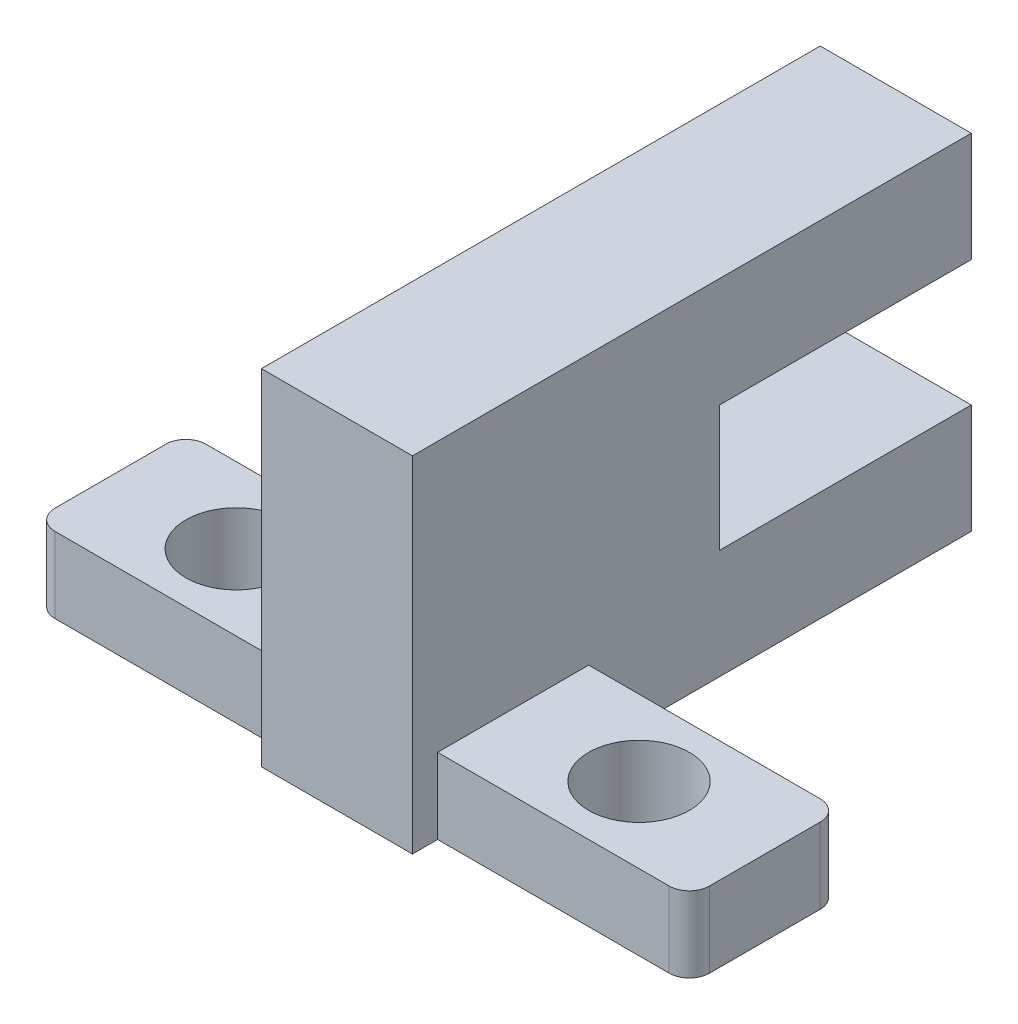
ISO-10303-21;
HEADER;
FILE_DESCRIPTION(('STEP AP214'),'2;1');
FILE_NAME('part.step','',(''),(''),'','','');
FILE_SCHEMA(('AUTOMOTIVE_DESIGN { 1 0 10303 214 1 1 1 1 }'));
ENDSEC;
DATA;
#1=APPLICATION_CONTEXT('core data for automotive mechanical design processes');
#2=APPLICATION_PROTOCOL_DEFINITION('international standard','automotive_design',2000,#1);
#3=PRODUCT_CONTEXT('',#1,'mechanical');
#4=PRODUCT('Part','Part','',(#3));
#5=PRODUCT_RELATED_PRODUCT_CATEGORY('part','',(#4));
#6=PRODUCT_DEFINITION_FORMATION('','',#4);
#7=PRODUCT_DEFINITION_CONTEXT('part definition',#1,'design');
#8=PRODUCT_DEFINITION('design','',#6,#7);
#9=PRODUCT_DEFINITION_SHAPE('','',#8);
#10=(LENGTH_UNIT() NAMED_UNIT(*) SI_UNIT(.MILLI.,.METRE.));
#11=(NAMED_UNIT(*) PLANE_ANGLE_UNIT() SI_UNIT($,.RADIAN.));
#12=(NAMED_UNIT(*) SI_UNIT($,.STERADIAN.) SOLID_ANGLE_UNIT());
#13=UNCERTAINTY_MEASURE_WITH_UNIT(LENGTH_MEASURE(1.E-05),#10,'distance_accuracy_value','');
#14=(GEOMETRIC_REPRESENTATION_CONTEXT(3) GLOBAL_UNCERTAINTY_ASSIGNED_CONTEXT((#13)) GLOBAL_UNIT_ASSIGNED_CONTEXT((#10,
#11,#12)) REPRESENTATION_CONTEXT('',''));
#15=CARTESIAN_POINT('',(0.,0.,0.));
#16=DIRECTION('',(0.,0.,1.));
#17=DIRECTION('',(1.,0.,0.));
#18=AXIS2_PLACEMENT_3D('',#15,#16,#17);
#19=CARTESIAN_POINT('',(6.,-2.5,0.));
#20=DIRECTION('',(0.,1.,0.));
#21=DIRECTION('',(0.,0.,1.));
#22=AXIS2_PLACEMENT_3D('',#19,#20,#21);
#23=PLANE('',#22);
#24=DIRECTION('',(0.,0.,-1.));
#25=VECTOR('',#24,1.);
#26=CARTESIAN_POINT('',(0.,-2.5,0.));
#27=LINE('',#26,#25);
#28=CARTESIAN_POINT('',(0.,-2.5,-1.1));
#29=VERTEX_POINT('',#28);
#30=CARTESIAN_POINT('',(0.,-2.5,-11.1));
#31=VERTEX_POINT('',#30);
#32=EDGE_CURVE('E211',#29,#31,#27,.T.);
#33=ORIENTED_EDGE('',*,*,#32,.F.);
#34=DIRECTION('',(-1.,0.,0.));
#35=VECTOR('',#34,1.);
#36=CARTESIAN_POINT('',(6.,-2.5,-1.1));
#37=LINE('',#36,#35);
#38=CARTESIAN_POINT('',(6.,-2.5,-1.1));
#39=VERTEX_POINT('',#38);
#40=EDGE_CURVE('E268',#39,#29,#37,.T.);
#41=ORIENTED_EDGE('',*,*,#40,.F.);
#42=DIRECTION('',(0.,0.,-1.));
#43=VECTOR('',#42,1.);
#44=CARTESIAN_POINT('',(6.,-2.5,0.));
#45=LINE('',#44,#43);
#46=CARTESIAN_POINT('',(6.,-2.5,-11.1));
#47=VERTEX_POINT('',#46);
#48=EDGE_CURVE('E212',#39,#47,#45,.T.);
#49=ORIENTED_EDGE('',*,*,#48,.T.);
#50=DIRECTION('',(-1.,0.,0.));
#51=VECTOR('',#50,1.);
#52=CARTESIAN_POINT('',(6.,-2.5,-11.1));
#53=LINE('',#52,#51);
#54=EDGE_CURVE('E252',#47,#31,#53,.T.);
#55=ORIENTED_EDGE('',*,*,#54,.T.);
#56=EDGE_LOOP('',(#33,#41,#49,#55));
#57=FACE_BOUND('',#56,.T.);
#58=ADVANCED_FACE('F37',(#57),#23,.T.);
#59=CARTESIAN_POINT('',(6.,0.,-1.1));
#60=DIRECTION('',(0.,0.,-1.));
#61=DIRECTION('',(0.,1.,0.));
#62=AXIS2_PLACEMENT_3D('',#59,#60,#61);
#63=PLANE('',#62);
#64=DIRECTION('',(0.,-1.,0.));
#65=VECTOR('',#64,1.);
#66=CARTESIAN_POINT('',(0.,0.,-1.1));
#67=LINE('',#66,#65);
#68=CARTESIAN_POINT('',(0.,2.5,-1.1));
#69=VERTEX_POINT('',#68);
#70=EDGE_CURVE('E234',#69,#29,#67,.T.);
#71=ORIENTED_EDGE('',*,*,#70,.F.);
#72=DIRECTION('',(-1.,0.,0.));
#73=VECTOR('',#72,1.);
#74=CARTESIAN_POINT('',(6.,2.5,-1.1));
#75=LINE('',#74,#73);
#76=CARTESIAN_POINT('',(6.,2.5,-1.1));
#77=VERTEX_POINT('',#76);
#78=EDGE_CURVE('E266',#77,#69,#75,.T.);
#79=ORIENTED_EDGE('',*,*,#78,.F.);
#80=DIRECTION('',(0.,-1.,0.));
#81=VECTOR('',#80,1.);
#82=CARTESIAN_POINT('',(6.,0.,-1.1));
#83=LINE('',#82,#81);
#84=EDGE_CURVE('E215',#77,#39,#83,.T.);
#85=ORIENTED_EDGE('',*,*,#84,.T.);
#86=ORIENTED_EDGE('',*,*,#40,.T.);
#87=EDGE_LOOP('',(#71,#79,#85,#86));
#88=FACE_BOUND('',#87,.T.);
#89=ADVANCED_FACE('F379',(#88),#63,.T.);
#90=CARTESIAN_POINT('',(6.,2.5,0.));
#91=DIRECTION('',(0.,1.,0.));
#92=DIRECTION('',(0.,0.,1.));
#93=AXIS2_PLACEMENT_3D('',#90,#91,#92);
#94=PLANE('',#93);
#95=DIRECTION('',(0.,0.,-1.));
#96=VECTOR('',#95,1.);
#97=CARTESIAN_POINT('',(0.,2.5,0.));
#98=LINE('',#97,#96);
#99=CARTESIAN_POINT('',(0.,2.5,-11.1));
#100=VERTEX_POINT('',#99);
#101=EDGE_CURVE('E237',#69,#100,#98,.T.);
#102=ORIENTED_EDGE('',*,*,#101,.T.);
#103=DIRECTION('',(-1.,0.,0.));
#104=VECTOR('',#103,1.);
#105=CARTESIAN_POINT('',(6.,2.5,-11.1));
#106=LINE('',#105,#104);
#107=CARTESIAN_POINT('',(6.,2.5,-11.1));
#108=VERTEX_POINT('',#107);
#109=EDGE_CURVE('E264',#108,#100,#106,.T.);
#110=ORIENTED_EDGE('',*,*,#109,.F.);
#111=DIRECTION('',(0.,0.,-1.));
#112=VECTOR('',#111,1.);
#113=CARTESIAN_POINT('',(6.,2.5,0.));
#114=LINE('',#113,#112);
#115=EDGE_CURVE('E219',#77,#108,#114,.T.);
#116=ORIENTED_EDGE('',*,*,#115,.F.);
#117=ORIENTED_EDGE('',*,*,#78,.T.);
#118=EDGE_LOOP('',(#102,#110,#116,#117));
#119=FACE_BOUND('',#118,.T.);
#120=ADVANCED_FACE('F385',(#119),#94,.F.);
#121=CARTESIAN_POINT('',(6.,0.,-11.1));
#122=DIRECTION('',(0.,0.,-1.));
#123=DIRECTION('',(0.,1.,0.));
#124=AXIS2_PLACEMENT_3D('',#121,#122,#123);
#125=PLANE('',#124);
#126=DIRECTION('',(0.,-1.,0.));
#127=VECTOR('',#126,1.);
#128=CARTESIAN_POINT('',(0.,0.,-11.1));
#129=LINE('',#128,#127);
#130=CARTESIAN_POINT('',(0.,6.85,-11.1));
#131=VERTEX_POINT('',#130);
#132=EDGE_CURVE('E240',#131,#100,#129,.T.);
#133=ORIENTED_EDGE('',*,*,#132,.F.);
#134=DIRECTION('',(-1.,0.,0.));
#135=VECTOR('',#134,1.);
#136=CARTESIAN_POINT('',(6.,6.85,-11.1));
#137=LINE('',#136,#135);
#138=CARTESIAN_POINT('',(6.,6.85,-11.1));
#139=VERTEX_POINT('',#138);
#140=EDGE_CURVE('E262',#139,#131,#137,.T.);
#141=ORIENTED_EDGE('',*,*,#140,.F.);
#142=DIRECTION('',(0.,-1.,0.));
#143=VECTOR('',#142,1.);
#144=CARTESIAN_POINT('',(6.,0.,-11.1));
#145=LINE('',#144,#143);
#146=EDGE_CURVE('E221',#139,#108,#145,.T.);
#147=ORIENTED_EDGE('',*,*,#146,.T.);
#148=ORIENTED_EDGE('',*,*,#109,.T.);
#149=EDGE_LOOP('',(#133,#141,#147,#148));
#150=FACE_BOUND('',#149,.T.);
#151=ADVANCED_FACE('F430',(#150),#125,.T.);
#152=CARTESIAN_POINT('',(6.,6.85,0.));
#153=DIRECTION('',(0.,1.,0.));
#154=DIRECTION('',(0.,0.,1.));
#155=AXIS2_PLACEMENT_3D('',#152,#153,#154);
#156=PLANE('',#155);
#157=DIRECTION('',(0.,0.,-1.));
#158=VECTOR('',#157,1.);
#159=CARTESIAN_POINT('',(0.,6.85,0.));
#160=LINE('',#159,#158);
#161=CARTESIAN_POINT('',(0.,6.85,11.1));
#162=VERTEX_POINT('',#161);
#163=EDGE_CURVE('E243',#162,#131,#160,.T.);
#164=ORIENTED_EDGE('',*,*,#163,.F.);
#165=DIRECTION('',(-1.,0.,0.));
#166=VECTOR('',#165,1.);
#167=CARTESIAN_POINT('',(6.,6.85,11.1));
#168=LINE('',#167,#166);
#169=CARTESIAN_POINT('',(6.,6.85,11.1));
#170=VERTEX_POINT('',#169);
#171=EDGE_CURVE('E260',#170,#162,#168,.T.);
#172=ORIENTED_EDGE('',*,*,#171,.F.);
#173=DIRECTION('',(0.,0.,-1.));
#174=VECTOR('',#173,1.);
#175=CARTESIAN_POINT('',(6.,6.85,0.));
#176=LINE('',#175,#174);
#177=EDGE_CURVE('E224',#170,#139,#176,.T.);
#178=ORIENTED_EDGE('',*,*,#177,.T.);
#179=ORIENTED_EDGE('',*,*,#140,.T.);
#180=EDGE_LOOP('',(#164,#172,#178,#179));
#181=FACE_BOUND('',#180,.T.);
#182=ADVANCED_FACE('F437',(#181),#156,.T.);
#183=CARTESIAN_POINT('',(6.,0.,11.1));
#184=DIRECTION('',(0.,0.,-1.));
#185=DIRECTION('',(0.,1.,0.));
#186=AXIS2_PLACEMENT_3D('',#183,#184,#185);
#187=PLANE('',#186);
#188=DIRECTION('',(0.,-1.,0.));
#189=VECTOR('',#188,1.);
#190=CARTESIAN_POINT('',(0.,0.,11.1));
#191=LINE('',#190,#189);
#192=CARTESIAN_POINT('',(0.,-6.85,11.1));
#193=VERTEX_POINT('',#192);
#194=EDGE_CURVE('E246',#162,#193,#191,.T.);
#195=ORIENTED_EDGE('',*,*,#194,.T.);
#196=DIRECTION('',(-1.,0.,0.));
#197=VECTOR('',#196,1.);
#198=CARTESIAN_POINT('',(6.,-6.85,11.1));
#199=LINE('',#198,#197);
#200=CARTESIAN_POINT('',(6.,-6.85,11.1));
#201=VERTEX_POINT('',#200);
#202=EDGE_CURVE('E257',#201,#193,#199,.T.);
#203=ORIENTED_EDGE('',*,*,#202,.F.);
#204=DIRECTION('',(0.,-1.,0.));
#205=VECTOR('',#204,1.);
#206=CARTESIAN_POINT('',(6.,0.,11.1));
#207=LINE('',#206,#205);
#208=EDGE_CURVE('E228',#170,#201,#207,.T.);
#209=ORIENTED_EDGE('',*,*,#208,.F.);
#210=ORIENTED_EDGE('',*,*,#171,.T.);
#211=EDGE_LOOP('',(#195,#203,#209,#210));
#212=FACE_BOUND('',#211,.T.);
#213=ADVANCED_FACE('F433',(#212),#187,.F.);
#214=CARTESIAN_POINT('',(6.,-6.85,0.));
#215=DIRECTION('',(0.,1.,0.));
#216=DIRECTION('',(0.,0.,1.));
#217=AXIS2_PLACEMENT_3D('',#214,#215,#216);
#218=PLANE('',#217);
#219=CARTESIAN_POINT('',(-5.,-6.85,7.1));
#220=DIRECTION('',(0.,1.,0.));
#221=DIRECTION('',(0.,0.,1.));
#222=AXIS2_PLACEMENT_3D('',#219,#220,#221);
#223=CIRCLE('',#222,2.);
#224=CARTESIAN_POINT('',(-5.,-6.85,9.1));
#225=VERTEX_POINT('',#224);
#226=EDGE_CURVE('E355',#225,#225,#223,.T.);
#227=ORIENTED_EDGE('',*,*,#226,.T.);
#228=EDGE_LOOP('',(#227));
#229=FACE_BOUND('',#228,.T.);
#230=CARTESIAN_POINT('',(11.,-6.85,7.1));
#231=DIRECTION('',(0.,1.,0.));
#232=DIRECTION('',(0.,0.,1.));
#233=AXIS2_PLACEMENT_3D('',#230,#231,#232);
#234=CIRCLE('',#233,2.);
#235=CARTESIAN_POINT('',(11.,-6.85,9.1));
#236=VERTEX_POINT('',#235);
#237=EDGE_CURVE('E347',#236,#236,#234,.T.);
#238=ORIENTED_EDGE('',*,*,#237,.T.);
#239=EDGE_LOOP('',(#238));
#240=FACE_BOUND('',#239,.T.);
#241=DIRECTION('',(0.,0.,-1.));
#242=VECTOR('',#241,1.);
#243=CARTESIAN_POINT('',(16.,-6.85,10.1));
#244=LINE('',#243,#242);
#245=CARTESIAN_POINT('',(16.,-6.85,9.3));
#246=VERTEX_POINT('',#245);
#247=CARTESIAN_POINT('',(16.,-6.85,4.9));
#248=VERTEX_POINT('',#247);
#249=EDGE_CURVE('E327',#246,#248,#244,.T.);
#250=ORIENTED_EDGE('',*,*,#249,.F.);
#251=CARTESIAN_POINT('',(15.2,-6.85,9.3));
#252=DIRECTION('',(0.,1.,0.));
#253=DIRECTION('',(0.,0.,1.));
#254=AXIS2_PLACEMENT_3D('',#251,#252,#253);
#255=CIRCLE('',#254,0.8);
#256=CARTESIAN_POINT('',(15.2,-6.85,10.1));
#257=VERTEX_POINT('',#256);
#258=EDGE_CURVE('E291',#246,#257,#255,.F.);
#259=ORIENTED_EDGE('',*,*,#258,.T.);
#260=DIRECTION('',(1.,0.,0.));
#261=VECTOR('',#260,1.);
#262=CARTESIAN_POINT('',(-10.,-6.85,10.1));
#263=LINE('',#262,#261);
#264=CARTESIAN_POINT('',(6.,-6.85,10.1));
#265=VERTEX_POINT('',#264);
#266=EDGE_CURVE('E204',#265,#257,#263,.T.);
#267=ORIENTED_EDGE('',*,*,#266,.F.);
#268=DIRECTION('',(0.,0.,-1.));
#269=VECTOR('',#268,1.);
#270=CARTESIAN_POINT('',(6.,-6.85,0.));
#271=LINE('',#270,#269);
#272=EDGE_CURVE('E181',#201,#265,#271,.T.);
#273=ORIENTED_EDGE('',*,*,#272,.F.);
#274=ORIENTED_EDGE('',*,*,#202,.T.);
#275=DIRECTION('',(0.,0.,-1.));
#276=VECTOR('',#275,1.);
#277=CARTESIAN_POINT('',(0.,-6.85,0.));
#278=LINE('',#277,#276);
#279=CARTESIAN_POINT('',(0.,-6.85,10.1));
#280=VERTEX_POINT('',#279);
#281=EDGE_CURVE('E249',#193,#280,#278,.T.);
#282=ORIENTED_EDGE('',*,*,#281,.T.);
#283=CARTESIAN_POINT('',(-9.2,-6.85,10.1));
#284=VERTEX_POINT('',#283);
#285=EDGE_CURVE('E207',#284,#280,#263,.T.);
#286=ORIENTED_EDGE('',*,*,#285,.F.);
#287=CARTESIAN_POINT('',(-9.2,-6.85,9.3));
#288=DIRECTION('',(0.,1.,0.));
#289=DIRECTION('',(0.,0.,1.));
#290=AXIS2_PLACEMENT_3D('',#287,#288,#289);
#291=CIRCLE('',#290,0.8);
#292=CARTESIAN_POINT('',(-10.,-6.85,9.3));
#293=VERTEX_POINT('',#292);
#294=EDGE_CURVE('E287',#284,#293,#291,.F.);
#295=ORIENTED_EDGE('',*,*,#294,.T.);
#296=DIRECTION('',(0.,0.,-1.));
#297=VECTOR('',#296,1.);
#298=CARTESIAN_POINT('',(-10.,-6.85,10.1));
#299=LINE('',#298,#297);
#300=CARTESIAN_POINT('',(-10.,-6.85,4.9));
#301=VERTEX_POINT('',#300);
#302=EDGE_CURVE('E323',#293,#301,#299,.T.);
#303=ORIENTED_EDGE('',*,*,#302,.T.);
#304=CARTESIAN_POINT('',(-9.2,-6.85,4.9));
#305=DIRECTION('',(0.,1.,0.));
#306=DIRECTION('',(0.,0.,1.));
#307=AXIS2_PLACEMENT_3D('',#304,#305,#306);
#308=CIRCLE('',#307,0.8);
#309=CARTESIAN_POINT('',(-9.2,-6.85,4.1));
#310=VERTEX_POINT('',#309);
#311=EDGE_CURVE('E285',#301,#310,#308,.F.);
#312=ORIENTED_EDGE('',*,*,#311,.T.);
#313=DIRECTION('',(1.,0.,0.));
#314=VECTOR('',#313,1.);
#315=CARTESIAN_POINT('',(-10.,-6.85,4.1));
#316=LINE('',#315,#314);
#317=CARTESIAN_POINT('',(0.,-6.85,4.1));
#318=VERTEX_POINT('',#317);
#319=EDGE_CURVE('E196',#310,#318,#316,.T.);
#320=ORIENTED_EDGE('',*,*,#319,.T.);
#321=CARTESIAN_POINT('',(0.,-6.85,-11.1));
#322=VERTEX_POINT('',#321);
#323=EDGE_CURVE('E248',#318,#322,#278,.T.);
#324=ORIENTED_EDGE('',*,*,#323,.T.);
#325=DIRECTION('',(-1.,0.,0.));
#326=VECTOR('',#325,1.);
#327=CARTESIAN_POINT('',(6.,-6.85,-11.1));
#328=LINE('',#327,#326);
#329=CARTESIAN_POINT('',(6.,-6.85,-11.1));
#330=VERTEX_POINT('',#329);
#331=EDGE_CURVE('E254',#330,#322,#328,.T.);
#332=ORIENTED_EDGE('',*,*,#331,.F.);
#333=CARTESIAN_POINT('',(6.,-6.85,4.1));
#334=VERTEX_POINT('',#333);
#335=EDGE_CURVE('E230',#334,#330,#271,.T.);
#336=ORIENTED_EDGE('',*,*,#335,.F.);
#337=CARTESIAN_POINT('',(15.2,-6.85,4.1));
#338=VERTEX_POINT('',#337);
#339=EDGE_CURVE('E330',#334,#338,#316,.T.);
#340=ORIENTED_EDGE('',*,*,#339,.T.);
#341=CARTESIAN_POINT('',(15.2,-6.85,4.9));
#342=DIRECTION('',(0.,1.,0.));
#343=DIRECTION('',(0.,0.,1.));
#344=AXIS2_PLACEMENT_3D('',#341,#342,#343);
#345=CIRCLE('',#344,0.8);
#346=EDGE_CURVE('E289',#338,#248,#345,.F.);
#347=ORIENTED_EDGE('',*,*,#346,.T.);
#348=EDGE_LOOP('',(#250,#259,#267,#273,#274,#282,#286,#295,#303,#312,#320,#324,#332,#336,#340,#347));
#349=FACE_BOUND('',#348,.T.);
#350=ADVANCED_FACE('F322',(#229,#240,#349),#218,.F.);
#351=EDGE_CURVE('E216',#31,#322,#129,.T.);
#352=ORIENTED_EDGE('',*,*,#351,.F.);
#353=ORIENTED_EDGE('',*,*,#54,.F.);
#354=EDGE_CURVE('E225',#47,#330,#145,.T.);
#355=ORIENTED_EDGE('',*,*,#354,.T.);
#356=ORIENTED_EDGE('',*,*,#331,.T.);
#357=EDGE_LOOP('',(#352,#353,#355,#356));
#358=FACE_BOUND('',#357,.T.);
#359=ADVANCED_FACE('F411',(#358),#125,.T.);
#360=CARTESIAN_POINT('',(6.,0.,0.));
#361=DIRECTION('',(1.,0.,0.));
#362=DIRECTION('',(0.,0.,-1.));
#363=AXIS2_PLACEMENT_3D('',#360,#361,#362);
#364=PLANE('',#363);
#365=DIRECTION('',(0.,1.,0.));
#366=VECTOR('',#365,1.);
#367=CARTESIAN_POINT('',(6.,0.,4.1));
#368=LINE('',#367,#366);
#369=CARTESIAN_POINT('',(6.,-3.85,4.1));
#370=VERTEX_POINT('',#369);
#371=EDGE_CURVE('E186',#334,#370,#368,.T.);
#372=ORIENTED_EDGE('',*,*,#371,.F.);
#373=ORIENTED_EDGE('',*,*,#335,.T.);
#374=ORIENTED_EDGE('',*,*,#354,.F.);
#375=ORIENTED_EDGE('',*,*,#48,.F.);
#376=ORIENTED_EDGE('',*,*,#84,.F.);
#377=ORIENTED_EDGE('',*,*,#115,.T.);
#378=ORIENTED_EDGE('',*,*,#146,.F.);
#379=ORIENTED_EDGE('',*,*,#177,.F.);
#380=ORIENTED_EDGE('',*,*,#208,.T.);
#381=ORIENTED_EDGE('',*,*,#272,.T.);
#382=DIRECTION('',(0.,-1.,0.));
#383=VECTOR('',#382,1.);
#384=CARTESIAN_POINT('',(6.,0.,10.1));
#385=LINE('',#384,#383);
#386=CARTESIAN_POINT('',(6.,-3.85,10.1));
#387=VERTEX_POINT('',#386);
#388=EDGE_CURVE('E175',#387,#265,#385,.T.);
#389=ORIENTED_EDGE('',*,*,#388,.F.);
#390=DIRECTION('',(0.,0.,1.));
#391=VECTOR('',#390,1.);
#392=CARTESIAN_POINT('',(6.,-3.85,0.));
#393=LINE('',#392,#391);
#394=EDGE_CURVE('E178',#370,#387,#393,.T.);
#395=ORIENTED_EDGE('',*,*,#394,.F.);
#396=EDGE_LOOP('',(#372,#373,#374,#375,#376,#377,#378,#379,#380,#381,#389,#395));
#397=FACE_BOUND('',#396,.T.);
#398=ADVANCED_FACE('F177',(#397),#364,.T.);
#399=CARTESIAN_POINT('',(0.,0.,0.));
#400=DIRECTION('',(1.,0.,0.));
#401=DIRECTION('',(0.,0.,-1.));
#402=AXIS2_PLACEMENT_3D('',#399,#400,#401);
#403=PLANE('',#402);
#404=ORIENTED_EDGE('',*,*,#323,.F.);
#405=DIRECTION('',(0.,1.,0.));
#406=VECTOR('',#405,1.);
#407=CARTESIAN_POINT('',(0.,0.,4.1));
#408=LINE('',#407,#406);
#409=CARTESIAN_POINT('',(0.,-3.85,4.1));
#410=VERTEX_POINT('',#409);
#411=EDGE_CURVE('E276',#318,#410,#408,.T.);
#412=ORIENTED_EDGE('',*,*,#411,.T.);
#413=DIRECTION('',(0.,0.,1.));
#414=VECTOR('',#413,1.);
#415=CARTESIAN_POINT('',(0.,-3.85,0.));
#416=LINE('',#415,#414);
#417=CARTESIAN_POINT('',(0.,-3.85,10.1));
#418=VERTEX_POINT('',#417);
#419=EDGE_CURVE('E270',#410,#418,#416,.T.);
#420=ORIENTED_EDGE('',*,*,#419,.T.);
#421=DIRECTION('',(0.,-1.,0.));
#422=VECTOR('',#421,1.);
#423=CARTESIAN_POINT('',(0.,0.,10.1));
#424=LINE('',#423,#422);
#425=EDGE_CURVE('E273',#418,#280,#424,.T.);
#426=ORIENTED_EDGE('',*,*,#425,.T.);
#427=ORIENTED_EDGE('',*,*,#281,.F.);
#428=ORIENTED_EDGE('',*,*,#194,.F.);
#429=ORIENTED_EDGE('',*,*,#163,.T.);
#430=ORIENTED_EDGE('',*,*,#132,.T.);
#431=ORIENTED_EDGE('',*,*,#101,.F.);
#432=ORIENTED_EDGE('',*,*,#70,.T.);
#433=ORIENTED_EDGE('',*,*,#32,.T.);
#434=ORIENTED_EDGE('',*,*,#351,.T.);
#435=EDGE_LOOP('',(#404,#412,#420,#426,#427,#428,#429,#430,#431,#432,#433,#434));
#436=FACE_BOUND('',#435,.T.);
#437=ADVANCED_FACE('F373',(#436),#403,.F.);
#438=CARTESIAN_POINT('',(-10.,0.,0.));
#439=DIRECTION('',(1.,0.,0.));
#440=DIRECTION('',(0.,0.,-1.));
#441=AXIS2_PLACEMENT_3D('',#438,#439,#440);
#442=PLANE('',#441);
#443=ORIENTED_EDGE('',*,*,#302,.F.);
#444=DIRECTION('',(0.,-1.,0.));
#445=VECTOR('',#444,1.);
#446=CARTESIAN_POINT('',(-10.,-3.85,9.3));
#447=LINE('',#446,#445);
#448=CARTESIAN_POINT('',(-10.,-3.85,9.3));
#449=VERTEX_POINT('',#448);
#450=EDGE_CURVE('E59',#293,#449,#447,.F.);
#451=ORIENTED_EDGE('',*,*,#450,.T.);
#452=DIRECTION('',(0.,0.,1.));
#453=VECTOR('',#452,1.);
#454=CARTESIAN_POINT('',(-10.,-3.85,10.1));
#455=LINE('',#454,#453);
#456=CARTESIAN_POINT('',(-10.,-3.85,4.9));
#457=VERTEX_POINT('',#456);
#458=EDGE_CURVE('E312',#457,#449,#455,.T.);
#459=ORIENTED_EDGE('',*,*,#458,.F.);
#460=DIRECTION('',(0.,1.,0.));
#461=VECTOR('',#460,1.);
#462=CARTESIAN_POINT('',(-10.,-6.85,4.9));
#463=LINE('',#462,#461);
#464=EDGE_CURVE('E303',#457,#301,#463,.F.);
#465=ORIENTED_EDGE('',*,*,#464,.T.);
#466=EDGE_LOOP('',(#443,#451,#459,#465));
#467=FACE_BOUND('',#466,.T.);
#468=ADVANCED_FACE('F325',(#467),#442,.F.);
#469=CARTESIAN_POINT('',(-10.,-3.85,10.1));
#470=DIRECTION('',(0.,1.,0.));
#471=DIRECTION('',(0.,0.,1.));
#472=AXIS2_PLACEMENT_3D('',#469,#470,#471);
#473=PLANE('',#472);
#474=CARTESIAN_POINT('',(-5.,-3.85,7.1));
#475=DIRECTION('',(0.,1.,0.));
#476=DIRECTION('',(0.,0.,1.));
#477=AXIS2_PLACEMENT_3D('',#474,#475,#476);
#478=CIRCLE('',#477,2.);
#479=CARTESIAN_POINT('',(-5.,-3.85,9.1));
#480=VERTEX_POINT('',#479);
#481=EDGE_CURVE('E358',#480,#480,#478,.T.);
#482=ORIENTED_EDGE('',*,*,#481,.F.);
#483=EDGE_LOOP('',(#482));
#484=FACE_BOUND('',#483,.T.);
#485=ORIENTED_EDGE('',*,*,#458,.T.);
#486=CARTESIAN_POINT('',(-9.2,-3.85,9.3));
#487=DIRECTION('',(0.,1.,0.));
#488=DIRECTION('',(0.,0.,1.));
#489=AXIS2_PLACEMENT_3D('',#486,#487,#488);
#490=CIRCLE('',#489,0.8);
#491=CARTESIAN_POINT('',(-9.2,-3.85,10.1));
#492=VERTEX_POINT('',#491);
#493=EDGE_CURVE('E45',#449,#492,#490,.T.);
#494=ORIENTED_EDGE('',*,*,#493,.T.);
#495=DIRECTION('',(1.,0.,0.));
#496=VECTOR('',#495,1.);
#497=CARTESIAN_POINT('',(-10.,-3.85,10.1));
#498=LINE('',#497,#496);
#499=EDGE_CURVE('E201',#492,#418,#498,.T.);
#500=ORIENTED_EDGE('',*,*,#499,.T.);
#501=ORIENTED_EDGE('',*,*,#419,.F.);
#502=DIRECTION('',(1.,0.,0.));
#503=VECTOR('',#502,1.);
#504=CARTESIAN_POINT('',(-10.,-3.85,4.1));
#505=LINE('',#504,#503);
#506=CARTESIAN_POINT('',(-9.2,-3.85,4.1));
#507=VERTEX_POINT('',#506);
#508=EDGE_CURVE('E202',#507,#410,#505,.T.);
#509=ORIENTED_EDGE('',*,*,#508,.F.);
#510=CARTESIAN_POINT('',(-9.2,-3.85,4.9));
#511=DIRECTION('',(0.,1.,0.));
#512=DIRECTION('',(0.,0.,1.));
#513=AXIS2_PLACEMENT_3D('',#510,#511,#512);
#514=CIRCLE('',#513,0.8);
#515=EDGE_CURVE('E52',#507,#457,#514,.T.);
#516=ORIENTED_EDGE('',*,*,#515,.T.);
#517=EDGE_LOOP('',(#485,#494,#500,#501,#509,#516));
#518=FACE_BOUND('',#517,.T.);
#519=ADVANCED_FACE('F309',(#484,#518),#473,.T.);
#520=CARTESIAN_POINT('',(-10.,-3.85,10.1));
#521=DIRECTION('',(0.,0.,1.));
#522=DIRECTION('',(1.,0.,0.));
#523=AXIS2_PLACEMENT_3D('',#520,#521,#522);
#524=PLANE('',#523);
#525=ORIENTED_EDGE('',*,*,#499,.F.);
#526=DIRECTION('',(0.,-1.,0.));
#527=VECTOR('',#526,1.);
#528=CARTESIAN_POINT('',(-9.2,-6.85,10.1));
#529=LINE('',#528,#527);
#530=EDGE_CURVE('E300',#492,#284,#529,.T.);
#531=ORIENTED_EDGE('',*,*,#530,.T.);
#532=ORIENTED_EDGE('',*,*,#285,.T.);
#533=ORIENTED_EDGE('',*,*,#425,.F.);
#534=EDGE_LOOP('',(#525,#531,#532,#533));
#535=FACE_BOUND('',#534,.T.);
#536=ADVANCED_FACE('F316',(#535),#524,.T.);
#537=CARTESIAN_POINT('',(-10.,-3.85,4.1));
#538=DIRECTION('',(0.,0.,-1.));
#539=DIRECTION('',(-1.,0.,0.));
#540=AXIS2_PLACEMENT_3D('',#537,#538,#539);
#541=PLANE('',#540);
#542=ORIENTED_EDGE('',*,*,#319,.F.);
#543=DIRECTION('',(0.,1.,0.));
#544=VECTOR('',#543,1.);
#545=CARTESIAN_POINT('',(-9.2,-3.85,4.1));
#546=LINE('',#545,#544);
#547=EDGE_CURVE('E11',#310,#507,#546,.T.);
#548=ORIENTED_EDGE('',*,*,#547,.T.);
#549=ORIENTED_EDGE('',*,*,#508,.T.);
#550=ORIENTED_EDGE('',*,*,#411,.F.);
#551=EDGE_LOOP('',(#542,#548,#549,#550));
#552=FACE_BOUND('',#551,.T.);
#553=ADVANCED_FACE('F371',(#552),#541,.T.);
#554=CARTESIAN_POINT('',(15.2,-3.85,4.1));
#555=VERTEX_POINT('',#554);
#556=EDGE_CURVE('E195',#370,#555,#505,.T.);
#557=ORIENTED_EDGE('',*,*,#556,.T.);
#558=DIRECTION('',(0.,1.,0.));
#559=VECTOR('',#558,1.);
#560=CARTESIAN_POINT('',(15.2,-3.85,4.1));
#561=LINE('',#560,#559);
#562=EDGE_CURVE('E298',#555,#338,#561,.F.);
#563=ORIENTED_EDGE('',*,*,#562,.T.);
#564=ORIENTED_EDGE('',*,*,#339,.F.);
#565=ORIENTED_EDGE('',*,*,#371,.T.);
#566=EDGE_LOOP('',(#557,#563,#564,#565));
#567=FACE_BOUND('',#566,.T.);
#568=ADVANCED_FACE('F416',(#567),#541,.T.);
#569=ORIENTED_EDGE('',*,*,#266,.T.);
#570=DIRECTION('',(0.,-1.,0.));
#571=VECTOR('',#570,1.);
#572=CARTESIAN_POINT('',(15.2,-3.85,10.1));
#573=LINE('',#572,#571);
#574=CARTESIAN_POINT('',(15.2,-3.85,10.1));
#575=VERTEX_POINT('',#574);
#576=EDGE_CURVE('E200',#257,#575,#573,.F.);
#577=ORIENTED_EDGE('',*,*,#576,.T.);
#578=EDGE_CURVE('E192',#387,#575,#498,.T.);
#579=ORIENTED_EDGE('',*,*,#578,.F.);
#580=ORIENTED_EDGE('',*,*,#388,.T.);
#581=EDGE_LOOP('',(#569,#577,#579,#580));
#582=FACE_BOUND('',#581,.T.);
#583=ADVANCED_FACE('F198',(#582),#524,.T.);
#584=CARTESIAN_POINT('',(11.,-3.85,7.1));
#585=DIRECTION('',(0.,1.,0.));
#586=DIRECTION('',(0.,0.,1.));
#587=AXIS2_PLACEMENT_3D('',#584,#585,#586);
#588=CIRCLE('',#587,2.);
#589=CARTESIAN_POINT('',(11.,-3.85,9.1));
#590=VERTEX_POINT('',#589);
#591=EDGE_CURVE('E350',#590,#590,#588,.T.);
#592=ORIENTED_EDGE('',*,*,#591,.F.);
#593=EDGE_LOOP('',(#592));
#594=FACE_BOUND('',#593,.T.);
#595=ORIENTED_EDGE('',*,*,#578,.T.);
#596=CARTESIAN_POINT('',(15.2,-3.85,9.3));
#597=DIRECTION('',(0.,1.,0.));
#598=DIRECTION('',(0.,0.,1.));
#599=AXIS2_PLACEMENT_3D('',#596,#597,#598);
#600=CIRCLE('',#599,0.8);
#601=CARTESIAN_POINT('',(16.,-3.85,9.3));
#602=VERTEX_POINT('',#601);
#603=EDGE_CURVE('E296',#575,#602,#600,.T.);
#604=ORIENTED_EDGE('',*,*,#603,.T.);
#605=DIRECTION('',(0.,0.,1.));
#606=VECTOR('',#605,1.);
#607=CARTESIAN_POINT('',(16.,-3.85,10.1));
#608=LINE('',#607,#606);
#609=CARTESIAN_POINT('',(16.,-3.85,4.9));
#610=VERTEX_POINT('',#609);
#611=EDGE_CURVE('E342',#610,#602,#608,.T.);
#612=ORIENTED_EDGE('',*,*,#611,.F.);
#613=CARTESIAN_POINT('',(15.2,-3.85,4.9));
#614=DIRECTION('',(0.,1.,0.));
#615=DIRECTION('',(0.,0.,1.));
#616=AXIS2_PLACEMENT_3D('',#613,#614,#615);
#617=CIRCLE('',#616,0.8);
#618=EDGE_CURVE('E294',#610,#555,#617,.T.);
#619=ORIENTED_EDGE('',*,*,#618,.T.);
#620=ORIENTED_EDGE('',*,*,#556,.F.);
#621=ORIENTED_EDGE('',*,*,#394,.T.);
#622=EDGE_LOOP('',(#595,#604,#612,#619,#620,#621));
#623=FACE_BOUND('',#622,.T.);
#624=ADVANCED_FACE('F191',(#594,#623),#473,.T.);
#625=CARTESIAN_POINT('',(16.,0.,0.));
#626=DIRECTION('',(1.,0.,0.));
#627=DIRECTION('',(0.,0.,-1.));
#628=AXIS2_PLACEMENT_3D('',#625,#626,#627);
#629=PLANE('',#628);
#630=ORIENTED_EDGE('',*,*,#611,.T.);
#631=DIRECTION('',(0.,-1.,0.));
#632=VECTOR('',#631,1.);
#633=CARTESIAN_POINT('',(16.,0.,9.3));
#634=LINE('',#633,#632);
#635=EDGE_CURVE('E282',#602,#246,#634,.T.);
#636=ORIENTED_EDGE('',*,*,#635,.T.);
#637=ORIENTED_EDGE('',*,*,#249,.T.);
#638=DIRECTION('',(0.,1.,0.));
#639=VECTOR('',#638,1.);
#640=CARTESIAN_POINT('',(16.,0.,4.9));
#641=LINE('',#640,#639);
#642=EDGE_CURVE('E279',#248,#610,#641,.T.);
#643=ORIENTED_EDGE('',*,*,#642,.T.);
#644=EDGE_LOOP('',(#630,#636,#637,#643));
#645=FACE_BOUND('',#644,.T.);
#646=ADVANCED_FACE('F344',(#645),#629,.T.);
#647=CARTESIAN_POINT('',(11.,-13.85,7.1));
#648=DIRECTION('',(0.,1.,0.));
#649=DIRECTION('',(0.,0.,1.));
#650=AXIS2_PLACEMENT_3D('',#647,#648,#649);
#651=CYLINDRICAL_SURFACE('',#650,2.);
#652=ORIENTED_EDGE('',*,*,#591,.T.);
#653=EDGE_LOOP('',(#652));
#654=FACE_BOUND('',#653,.T.);
#655=ORIENTED_EDGE('',*,*,#237,.F.);
#656=EDGE_LOOP('',(#655));
#657=FACE_BOUND('',#656,.T.);
#658=ADVANCED_FACE('F532',(#654,#657),#651,.F.);
#659=CARTESIAN_POINT('',(-5.,-13.85,7.1));
#660=DIRECTION('',(0.,1.,0.));
#661=DIRECTION('',(0.,0.,1.));
#662=AXIS2_PLACEMENT_3D('',#659,#660,#661);
#663=CYLINDRICAL_SURFACE('',#662,2.);
#664=ORIENTED_EDGE('',*,*,#481,.T.);
#665=EDGE_LOOP('',(#664));
#666=FACE_BOUND('',#665,.T.);
#667=ORIENTED_EDGE('',*,*,#226,.F.);
#668=EDGE_LOOP('',(#667));
#669=FACE_BOUND('',#668,.T.);
#670=ADVANCED_FACE('F362',(#666,#669),#663,.F.);
#671=CARTESIAN_POINT('',(15.2,0.,9.3));
#672=DIRECTION('',(0.,-1.,0.));
#673=DIRECTION('',(0.,0.,-1.));
#674=AXIS2_PLACEMENT_3D('',#671,#672,#673);
#675=CYLINDRICAL_SURFACE('',#674,0.8);
#676=ORIENTED_EDGE('',*,*,#603,.F.);
#677=ORIENTED_EDGE('',*,*,#576,.F.);
#678=ORIENTED_EDGE('',*,*,#258,.F.);
#679=ORIENTED_EDGE('',*,*,#635,.F.);
#680=EDGE_LOOP('',(#676,#677,#678,#679));
#681=FACE_BOUND('',#680,.T.);
#682=ADVANCED_FACE('F338',(#681),#675,.T.);
#683=CARTESIAN_POINT('',(15.2,0.,4.9));
#684=DIRECTION('',(0.,1.,0.));
#685=DIRECTION('',(0.,0.,1.));
#686=AXIS2_PLACEMENT_3D('',#683,#684,#685);
#687=CYLINDRICAL_SURFACE('',#686,0.8);
#688=ORIENTED_EDGE('',*,*,#346,.F.);
#689=ORIENTED_EDGE('',*,*,#562,.F.);
#690=ORIENTED_EDGE('',*,*,#618,.F.);
#691=ORIENTED_EDGE('',*,*,#642,.F.);
#692=EDGE_LOOP('',(#688,#689,#690,#691));
#693=FACE_BOUND('',#692,.T.);
#694=ADVANCED_FACE('F393',(#693),#687,.T.);
#695=CARTESIAN_POINT('',(-9.2,-3.85,9.3));
#696=DIRECTION('',(0.,1.,0.));
#697=DIRECTION('',(0.,0.,1.));
#698=AXIS2_PLACEMENT_3D('',#695,#696,#697);
#699=CYLINDRICAL_SURFACE('',#698,0.8);
#700=ORIENTED_EDGE('',*,*,#493,.F.);
#701=ORIENTED_EDGE('',*,*,#450,.F.);
#702=ORIENTED_EDGE('',*,*,#294,.F.);
#703=ORIENTED_EDGE('',*,*,#530,.F.);
#704=EDGE_LOOP('',(#700,#701,#702,#703));
#705=FACE_BOUND('',#704,.T.);
#706=ADVANCED_FACE('F318',(#705),#699,.T.);
#707=CARTESIAN_POINT('',(-9.2,-3.85,4.9));
#708=DIRECTION('',(0.,-1.,0.));
#709=DIRECTION('',(0.,0.,-1.));
#710=AXIS2_PLACEMENT_3D('',#707,#708,#709);
#711=CYLINDRICAL_SURFACE('',#710,0.8);
#712=ORIENTED_EDGE('',*,*,#311,.F.);
#713=ORIENTED_EDGE('',*,*,#464,.F.);
#714=ORIENTED_EDGE('',*,*,#515,.F.);
#715=ORIENTED_EDGE('',*,*,#547,.F.);
#716=EDGE_LOOP('',(#712,#713,#714,#715));
#717=FACE_BOUND('',#716,.T.);
#718=ADVANCED_FACE('F39',(#717),#711,.T.);
#719=CLOSED_SHELL('',(#58,#89,#120,#151,#182,#213,#350,#359,#398,#437,#468,#519,#536,#553,#568,
#583,#624,#646,#658,#670,#682,#694,#706,#718));
#720=MANIFOLD_SOLID_BREP('B2',#719);
#721=ADVANCED_BREP_SHAPE_REPRESENTATION('',(#18,#720),#14);
#722=SHAPE_DEFINITION_REPRESENTATION(#9,#721);
ENDSEC;
END-ISO-10303-21;
